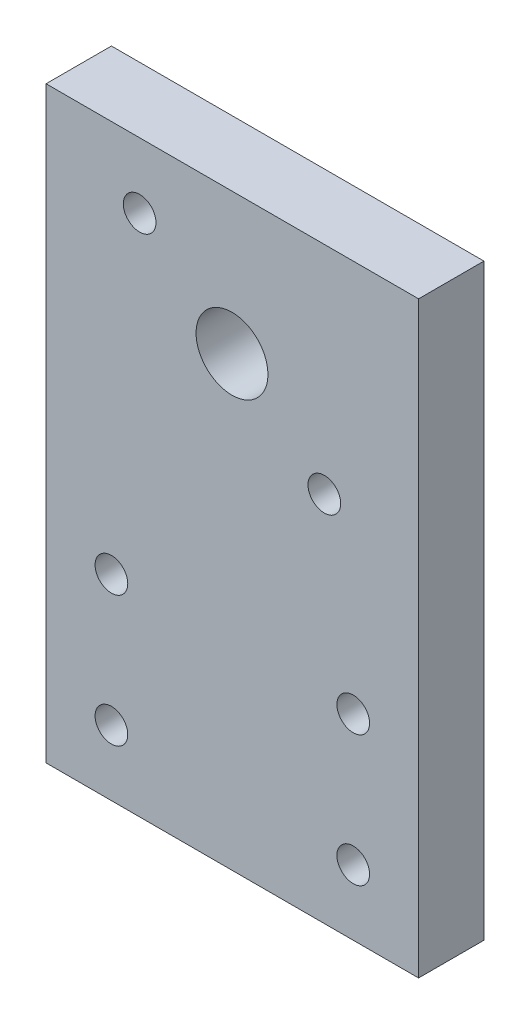
ISO-10303-21;
HEADER;
FILE_DESCRIPTION(('STEP AP214'),'2;1');
FILE_NAME('part.step','',(''),(''),'','','');
FILE_SCHEMA(('AUTOMOTIVE_DESIGN { 1 0 10303 214 1 1 1 1 }'));
ENDSEC;
DATA;
#1=APPLICATION_CONTEXT('core data for automotive mechanical design processes');
#2=APPLICATION_PROTOCOL_DEFINITION('international standard','automotive_design',2000,#1);
#3=PRODUCT_CONTEXT('',#1,'mechanical');
#4=PRODUCT('Part','Part','',(#3));
#5=PRODUCT_RELATED_PRODUCT_CATEGORY('part','',(#4));
#6=PRODUCT_DEFINITION_FORMATION('','',#4);
#7=PRODUCT_DEFINITION_CONTEXT('part definition',#1,'design');
#8=PRODUCT_DEFINITION('design','',#6,#7);
#9=PRODUCT_DEFINITION_SHAPE('','',#8);
#10=(LENGTH_UNIT() NAMED_UNIT(*) SI_UNIT(.MILLI.,.METRE.));
#11=(NAMED_UNIT(*) PLANE_ANGLE_UNIT() SI_UNIT($,.RADIAN.));
#12=(NAMED_UNIT(*) SI_UNIT($,.STERADIAN.) SOLID_ANGLE_UNIT());
#13=UNCERTAINTY_MEASURE_WITH_UNIT(LENGTH_MEASURE(1.E-05),#10,'distance_accuracy_value','');
#14=(GEOMETRIC_REPRESENTATION_CONTEXT(3) GLOBAL_UNCERTAINTY_ASSIGNED_CONTEXT((#13)) GLOBAL_UNIT_ASSIGNED_CONTEXT((#10,
#11,#12)) REPRESENTATION_CONTEXT('',''));
#15=CARTESIAN_POINT('',(0.,0.,0.));
#16=DIRECTION('',(0.,0.,1.));
#17=DIRECTION('',(1.,0.,0.));
#18=AXIS2_PLACEMENT_3D('',#15,#16,#17);
#19=CARTESIAN_POINT('',(0.,90.,10.));
#20=DIRECTION('',(1.,0.,0.));
#21=DIRECTION('',(0.,1.,0.));
#22=AXIS2_PLACEMENT_3D('',#19,#20,#21);
#23=PLANE('',#22);
#24=DIRECTION('',(0.,-1.,0.));
#25=VECTOR('',#24,1.);
#26=CARTESIAN_POINT('',(0.,90.,0.));
#27=LINE('',#26,#25);
#28=CARTESIAN_POINT('',(0.,90.,0.));
#29=VERTEX_POINT('',#28);
#30=CARTESIAN_POINT('',(0.,0.,0.));
#31=VERTEX_POINT('',#30);
#32=EDGE_CURVE('E111',#29,#31,#27,.T.);
#33=ORIENTED_EDGE('',*,*,#32,.T.);
#34=DIRECTION('',(0.,0.,-1.));
#35=VECTOR('',#34,1.);
#36=CARTESIAN_POINT('',(0.,0.,10.));
#37=LINE('',#36,#35);
#38=CARTESIAN_POINT('',(0.,0.,10.));
#39=VERTEX_POINT('',#38);
#40=EDGE_CURVE('E11',#39,#31,#37,.T.);
#41=ORIENTED_EDGE('',*,*,#40,.F.);
#42=DIRECTION('',(0.,-1.,0.));
#43=VECTOR('',#42,1.);
#44=CARTESIAN_POINT('',(0.,90.,10.));
#45=LINE('',#44,#43);
#46=CARTESIAN_POINT('',(0.,90.,10.));
#47=VERTEX_POINT('',#46);
#48=EDGE_CURVE('E95',#47,#39,#45,.T.);
#49=ORIENTED_EDGE('',*,*,#48,.F.);
#50=DIRECTION('',(0.,0.,-1.));
#51=VECTOR('',#50,1.);
#52=CARTESIAN_POINT('',(0.,90.,10.));
#53=LINE('',#52,#51);
#54=EDGE_CURVE('E107',#47,#29,#53,.T.);
#55=ORIENTED_EDGE('',*,*,#54,.T.);
#56=EDGE_LOOP('',(#33,#41,#49,#55));
#57=FACE_BOUND('',#56,.T.);
#58=ADVANCED_FACE('F43',(#57),#23,.F.);
#59=CARTESIAN_POINT('',(0.,0.,10.));
#60=DIRECTION('',(0.,1.,0.));
#61=DIRECTION('',(0.,0.,1.));
#62=AXIS2_PLACEMENT_3D('',#59,#60,#61);
#63=PLANE('',#62);
#64=DIRECTION('',(1.,0.,0.));
#65=VECTOR('',#64,1.);
#66=CARTESIAN_POINT('',(0.,0.,0.));
#67=LINE('',#66,#65);
#68=CARTESIAN_POINT('',(57.,0.,0.));
#69=VERTEX_POINT('',#68);
#70=EDGE_CURVE('E100',#31,#69,#67,.T.);
#71=ORIENTED_EDGE('',*,*,#70,.T.);
#72=DIRECTION('',(0.,0.,-1.));
#73=VECTOR('',#72,1.);
#74=CARTESIAN_POINT('',(57.,0.,10.));
#75=LINE('',#74,#73);
#76=CARTESIAN_POINT('',(57.,0.,10.));
#77=VERTEX_POINT('',#76);
#78=EDGE_CURVE('E52',#77,#69,#75,.T.);
#79=ORIENTED_EDGE('',*,*,#78,.F.);
#80=DIRECTION('',(1.,0.,0.));
#81=VECTOR('',#80,1.);
#82=CARTESIAN_POINT('',(0.,0.,10.));
#83=LINE('',#82,#81);
#84=EDGE_CURVE('E90',#39,#77,#83,.T.);
#85=ORIENTED_EDGE('',*,*,#84,.F.);
#86=ORIENTED_EDGE('',*,*,#40,.T.);
#87=EDGE_LOOP('',(#71,#79,#85,#86));
#88=FACE_BOUND('',#87,.T.);
#89=ADVANCED_FACE('F99',(#88),#63,.F.);
#90=CARTESIAN_POINT('',(57.,0.,10.));
#91=DIRECTION('',(-1.,0.,0.));
#92=DIRECTION('',(0.,0.,1.));
#93=AXIS2_PLACEMENT_3D('',#90,#91,#92);
#94=PLANE('',#93);
#95=DIRECTION('',(0.,1.,0.));
#96=VECTOR('',#95,1.);
#97=CARTESIAN_POINT('',(57.,0.,0.));
#98=LINE('',#97,#96);
#99=CARTESIAN_POINT('',(57.,90.,0.));
#100=VERTEX_POINT('',#99);
#101=EDGE_CURVE('E77',#69,#100,#98,.T.);
#102=ORIENTED_EDGE('',*,*,#101,.T.);
#103=DIRECTION('',(0.,0.,-1.));
#104=VECTOR('',#103,1.);
#105=CARTESIAN_POINT('',(57.,90.,10.));
#106=LINE('',#105,#104);
#107=CARTESIAN_POINT('',(57.,90.,10.));
#108=VERTEX_POINT('',#107);
#109=EDGE_CURVE('E102',#108,#100,#106,.T.);
#110=ORIENTED_EDGE('',*,*,#109,.F.);
#111=DIRECTION('',(0.,1.,0.));
#112=VECTOR('',#111,1.);
#113=CARTESIAN_POINT('',(57.,0.,10.));
#114=LINE('',#113,#112);
#115=EDGE_CURVE('E93',#77,#108,#114,.T.);
#116=ORIENTED_EDGE('',*,*,#115,.F.);
#117=ORIENTED_EDGE('',*,*,#78,.T.);
#118=EDGE_LOOP('',(#102,#110,#116,#117));
#119=FACE_BOUND('',#118,.T.);
#120=ADVANCED_FACE('F103',(#119),#94,.F.);
#121=CARTESIAN_POINT('',(57.,90.,10.));
#122=DIRECTION('',(0.,-1.,0.));
#123=DIRECTION('',(0.,0.,-1.));
#124=AXIS2_PLACEMENT_3D('',#121,#122,#123);
#125=PLANE('',#124);
#126=DIRECTION('',(-1.,0.,0.));
#127=VECTOR('',#126,1.);
#128=CARTESIAN_POINT('',(57.,90.,0.));
#129=LINE('',#128,#127);
#130=EDGE_CURVE('E83',#100,#29,#129,.T.);
#131=ORIENTED_EDGE('',*,*,#130,.T.);
#132=ORIENTED_EDGE('',*,*,#54,.F.);
#133=DIRECTION('',(-1.,0.,0.));
#134=VECTOR('',#133,1.);
#135=CARTESIAN_POINT('',(57.,90.,10.));
#136=LINE('',#135,#134);
#137=EDGE_CURVE('E60',#108,#47,#136,.T.);
#138=ORIENTED_EDGE('',*,*,#137,.F.);
#139=ORIENTED_EDGE('',*,*,#109,.T.);
#140=EDGE_LOOP('',(#131,#132,#138,#139));
#141=FACE_BOUND('',#140,.T.);
#142=ADVANCED_FACE('F125',(#141),#125,.F.);
#143=CARTESIAN_POINT('',(0.,0.,10.));
#144=DIRECTION('',(0.,0.,1.));
#145=DIRECTION('',(1.,0.,0.));
#146=AXIS2_PLACEMENT_3D('',#143,#144,#145);
#147=PLANE('',#146);
#148=CARTESIAN_POINT('',(28.45,68.45,10.));
#149=DIRECTION('',(0.,0.,1.));
#150=DIRECTION('',(1.,0.,0.));
#151=AXIS2_PLACEMENT_3D('',#148,#149,#150);
#152=CIRCLE('',#151,5.5);
#153=CARTESIAN_POINT('',(33.95,68.45,10.));
#154=VERTEX_POINT('',#153);
#155=EDGE_CURVE('E160',#154,#154,#152,.T.);
#156=ORIENTED_EDGE('',*,*,#155,.F.);
#157=EDGE_LOOP('',(#156));
#158=FACE_BOUND('',#157,.T.);
#159=CARTESIAN_POINT('',(10.,10.,10.));
#160=DIRECTION('',(0.,0.,1.));
#161=DIRECTION('',(1.,0.,0.));
#162=AXIS2_PLACEMENT_3D('',#159,#160,#161);
#163=CIRCLE('',#162,2.5);
#164=CARTESIAN_POINT('',(12.5,10.,10.));
#165=VERTEX_POINT('',#164);
#166=EDGE_CURVE('E145',#165,#165,#163,.T.);
#167=ORIENTED_EDGE('',*,*,#166,.F.);
#168=EDGE_LOOP('',(#167));
#169=FACE_BOUND('',#168,.T.);
#170=CARTESIAN_POINT('',(47.,30.,10.));
#171=DIRECTION('',(0.,0.,1.));
#172=DIRECTION('',(1.,0.,0.));
#173=AXIS2_PLACEMENT_3D('',#170,#171,#172);
#174=CIRCLE('',#173,2.5);
#175=CARTESIAN_POINT('',(49.5,30.,10.));
#176=VERTEX_POINT('',#175);
#177=EDGE_CURVE('E144',#176,#176,#174,.T.);
#178=ORIENTED_EDGE('',*,*,#177,.F.);
#179=EDGE_LOOP('',(#178));
#180=FACE_BOUND('',#179,.T.);
#181=CARTESIAN_POINT('',(10.,30.,10.));
#182=DIRECTION('',(0.,0.,1.));
#183=DIRECTION('',(1.,0.,0.));
#184=AXIS2_PLACEMENT_3D('',#181,#182,#183);
#185=CIRCLE('',#184,2.5);
#186=CARTESIAN_POINT('',(12.5,30.,10.));
#187=VERTEX_POINT('',#186);
#188=EDGE_CURVE('E136',#187,#187,#185,.T.);
#189=ORIENTED_EDGE('',*,*,#188,.F.);
#190=EDGE_LOOP('',(#189));
#191=FACE_BOUND('',#190,.T.);
#192=CARTESIAN_POINT('',(42.5801096952572,56.9,10.));
#193=DIRECTION('',(0.,0.,1.));
#194=DIRECTION('',(1.,0.,0.));
#195=AXIS2_PLACEMENT_3D('',#192,#193,#194);
#196=CIRCLE('',#195,2.5);
#197=CARTESIAN_POINT('',(45.0801096952572,56.9,10.));
#198=VERTEX_POINT('',#197);
#199=EDGE_CURVE('E161',#198,#198,#196,.T.);
#200=ORIENTED_EDGE('',*,*,#199,.F.);
#201=EDGE_LOOP('',(#200));
#202=FACE_BOUND('',#201,.T.);
#203=CARTESIAN_POINT('',(14.3198903047429,80.,10.));
#204=DIRECTION('',(0.,0.,1.));
#205=DIRECTION('',(1.,0.,0.));
#206=AXIS2_PLACEMENT_3D('',#203,#204,#205);
#207=CIRCLE('',#206,2.5);
#208=CARTESIAN_POINT('',(16.8198903047429,80.,10.));
#209=VERTEX_POINT('',#208);
#210=EDGE_CURVE('E176',#209,#209,#207,.T.);
#211=ORIENTED_EDGE('',*,*,#210,.F.);
#212=EDGE_LOOP('',(#211));
#213=FACE_BOUND('',#212,.T.);
#214=CARTESIAN_POINT('',(47.,10.,10.));
#215=DIRECTION('',(0.,0.,1.));
#216=DIRECTION('',(1.,0.,0.));
#217=AXIS2_PLACEMENT_3D('',#214,#215,#216);
#218=CIRCLE('',#217,2.5);
#219=CARTESIAN_POINT('',(49.5,10.,10.));
#220=VERTEX_POINT('',#219);
#221=EDGE_CURVE('E132',#220,#220,#218,.T.);
#222=ORIENTED_EDGE('',*,*,#221,.F.);
#223=EDGE_LOOP('',(#222));
#224=FACE_BOUND('',#223,.T.);
#225=ORIENTED_EDGE('',*,*,#48,.T.);
#226=ORIENTED_EDGE('',*,*,#84,.T.);
#227=ORIENTED_EDGE('',*,*,#115,.T.);
#228=ORIENTED_EDGE('',*,*,#137,.T.);
#229=EDGE_LOOP('',(#225,#226,#227,#228));
#230=FACE_BOUND('',#229,.T.);
#231=ADVANCED_FACE('F91',(#158,#169,#180,#191,#202,#213,#224,#230),#147,.T.);
#232=CARTESIAN_POINT('',(0.,0.,0.));
#233=DIRECTION('',(0.,0.,1.));
#234=DIRECTION('',(1.,0.,0.));
#235=AXIS2_PLACEMENT_3D('',#232,#233,#234);
#236=PLANE('',#235);
#237=CARTESIAN_POINT('',(28.45,68.45,0.));
#238=DIRECTION('',(0.,0.,1.));
#239=DIRECTION('',(1.,0.,0.));
#240=AXIS2_PLACEMENT_3D('',#237,#238,#239);
#241=CIRCLE('',#240,5.5);
#242=CARTESIAN_POINT('',(33.95,68.45,0.));
#243=VERTEX_POINT('',#242);
#244=EDGE_CURVE('E156',#243,#243,#241,.T.);
#245=ORIENTED_EDGE('',*,*,#244,.T.);
#246=EDGE_LOOP('',(#245));
#247=FACE_BOUND('',#246,.T.);
#248=CARTESIAN_POINT('',(10.,10.,0.));
#249=DIRECTION('',(0.,0.,1.));
#250=DIRECTION('',(1.,0.,0.));
#251=AXIS2_PLACEMENT_3D('',#248,#249,#250);
#252=CIRCLE('',#251,2.5);
#253=CARTESIAN_POINT('',(12.5,10.,0.));
#254=VERTEX_POINT('',#253);
#255=EDGE_CURVE('E165',#254,#254,#252,.T.);
#256=ORIENTED_EDGE('',*,*,#255,.T.);
#257=EDGE_LOOP('',(#256));
#258=FACE_BOUND('',#257,.T.);
#259=CARTESIAN_POINT('',(47.,30.,0.));
#260=DIRECTION('',(0.,0.,1.));
#261=DIRECTION('',(1.,0.,0.));
#262=AXIS2_PLACEMENT_3D('',#259,#260,#261);
#263=CIRCLE('',#262,2.5);
#264=CARTESIAN_POINT('',(49.5,30.,0.));
#265=VERTEX_POINT('',#264);
#266=EDGE_CURVE('E140',#265,#265,#263,.T.);
#267=ORIENTED_EDGE('',*,*,#266,.T.);
#268=EDGE_LOOP('',(#267));
#269=FACE_BOUND('',#268,.T.);
#270=CARTESIAN_POINT('',(10.,30.,0.));
#271=DIRECTION('',(0.,0.,1.));
#272=DIRECTION('',(1.,0.,0.));
#273=AXIS2_PLACEMENT_3D('',#270,#271,#272);
#274=CIRCLE('',#273,2.5);
#275=CARTESIAN_POINT('',(12.5,30.,0.));
#276=VERTEX_POINT('',#275);
#277=EDGE_CURVE('E149',#276,#276,#274,.T.);
#278=ORIENTED_EDGE('',*,*,#277,.T.);
#279=EDGE_LOOP('',(#278));
#280=FACE_BOUND('',#279,.T.);
#281=CARTESIAN_POINT('',(42.5801096952572,56.9,0.));
#282=DIRECTION('',(0.,0.,1.));
#283=DIRECTION('',(1.,0.,0.));
#284=AXIS2_PLACEMENT_3D('',#281,#282,#283);
#285=CIRCLE('',#284,2.5);
#286=CARTESIAN_POINT('',(45.0801096952572,56.9,0.));
#287=VERTEX_POINT('',#286);
#288=EDGE_CURVE('E180',#287,#287,#285,.T.);
#289=ORIENTED_EDGE('',*,*,#288,.T.);
#290=EDGE_LOOP('',(#289));
#291=FACE_BOUND('',#290,.T.);
#292=CARTESIAN_POINT('',(14.3198903047429,80.,0.));
#293=DIRECTION('',(0.,0.,1.));
#294=DIRECTION('',(1.,0.,0.));
#295=AXIS2_PLACEMENT_3D('',#292,#293,#294);
#296=CIRCLE('',#295,2.5);
#297=CARTESIAN_POINT('',(16.8198903047429,80.,0.));
#298=VERTEX_POINT('',#297);
#299=EDGE_CURVE('E172',#298,#298,#296,.T.);
#300=ORIENTED_EDGE('',*,*,#299,.T.);
#301=EDGE_LOOP('',(#300));
#302=FACE_BOUND('',#301,.T.);
#303=CARTESIAN_POINT('',(47.,10.,0.));
#304=DIRECTION('',(0.,0.,1.));
#305=DIRECTION('',(1.,0.,0.));
#306=AXIS2_PLACEMENT_3D('',#303,#304,#305);
#307=CIRCLE('',#306,2.5);
#308=CARTESIAN_POINT('',(49.5,10.,0.));
#309=VERTEX_POINT('',#308);
#310=EDGE_CURVE('E115',#309,#309,#307,.T.);
#311=ORIENTED_EDGE('',*,*,#310,.T.);
#312=EDGE_LOOP('',(#311));
#313=FACE_BOUND('',#312,.T.);
#314=ORIENTED_EDGE('',*,*,#32,.F.);
#315=ORIENTED_EDGE('',*,*,#130,.F.);
#316=ORIENTED_EDGE('',*,*,#101,.F.);
#317=ORIENTED_EDGE('',*,*,#70,.F.);
#318=EDGE_LOOP('',(#314,#315,#316,#317));
#319=FACE_BOUND('',#318,.T.);
#320=ADVANCED_FACE('F128',(#247,#258,#269,#280,#291,#302,#313,#319),#236,.F.);
#321=CARTESIAN_POINT('',(47.,10.,0.));
#322=DIRECTION('',(0.,0.,1.));
#323=DIRECTION('',(1.,0.,0.));
#324=AXIS2_PLACEMENT_3D('',#321,#322,#323);
#325=CYLINDRICAL_SURFACE('',#324,2.5);
#326=ORIENTED_EDGE('',*,*,#310,.F.);
#327=EDGE_LOOP('',(#326));
#328=FACE_BOUND('',#327,.T.);
#329=ORIENTED_EDGE('',*,*,#221,.T.);
#330=EDGE_LOOP('',(#329));
#331=FACE_BOUND('',#330,.T.);
#332=ADVANCED_FACE('F198',(#328,#331),#325,.F.);
#333=CARTESIAN_POINT('',(14.3198903047429,80.,0.));
#334=DIRECTION('',(0.,0.,1.));
#335=DIRECTION('',(1.,0.,0.));
#336=AXIS2_PLACEMENT_3D('',#333,#334,#335);
#337=CYLINDRICAL_SURFACE('',#336,2.5);
#338=ORIENTED_EDGE('',*,*,#299,.F.);
#339=EDGE_LOOP('',(#338));
#340=FACE_BOUND('',#339,.T.);
#341=ORIENTED_EDGE('',*,*,#210,.T.);
#342=EDGE_LOOP('',(#341));
#343=FACE_BOUND('',#342,.T.);
#344=ADVANCED_FACE('F200',(#340,#343),#337,.F.);
#345=CARTESIAN_POINT('',(42.5801096952572,56.9,0.));
#346=DIRECTION('',(0.,0.,1.));
#347=DIRECTION('',(1.,0.,0.));
#348=AXIS2_PLACEMENT_3D('',#345,#346,#347);
#349=CYLINDRICAL_SURFACE('',#348,2.5);
#350=ORIENTED_EDGE('',*,*,#288,.F.);
#351=EDGE_LOOP('',(#350));
#352=FACE_BOUND('',#351,.T.);
#353=ORIENTED_EDGE('',*,*,#199,.T.);
#354=EDGE_LOOP('',(#353));
#355=FACE_BOUND('',#354,.T.);
#356=ADVANCED_FACE('F188',(#352,#355),#349,.F.);
#357=CARTESIAN_POINT('',(10.,30.,0.));
#358=DIRECTION('',(0.,0.,1.));
#359=DIRECTION('',(1.,0.,0.));
#360=AXIS2_PLACEMENT_3D('',#357,#358,#359);
#361=CYLINDRICAL_SURFACE('',#360,2.5);
#362=ORIENTED_EDGE('',*,*,#277,.F.);
#363=EDGE_LOOP('',(#362));
#364=FACE_BOUND('',#363,.T.);
#365=ORIENTED_EDGE('',*,*,#188,.T.);
#366=EDGE_LOOP('',(#365));
#367=FACE_BOUND('',#366,.T.);
#368=ADVANCED_FACE('F257',(#364,#367),#361,.F.);
#369=CARTESIAN_POINT('',(47.,30.,0.));
#370=DIRECTION('',(0.,0.,1.));
#371=DIRECTION('',(1.,0.,0.));
#372=AXIS2_PLACEMENT_3D('',#369,#370,#371);
#373=CYLINDRICAL_SURFACE('',#372,2.5);
#374=ORIENTED_EDGE('',*,*,#266,.F.);
#375=EDGE_LOOP('',(#374));
#376=FACE_BOUND('',#375,.T.);
#377=ORIENTED_EDGE('',*,*,#177,.T.);
#378=EDGE_LOOP('',(#377));
#379=FACE_BOUND('',#378,.T.);
#380=ADVANCED_FACE('F268',(#376,#379),#373,.F.);
#381=CARTESIAN_POINT('',(10.,10.,0.));
#382=DIRECTION('',(0.,0.,1.));
#383=DIRECTION('',(1.,0.,0.));
#384=AXIS2_PLACEMENT_3D('',#381,#382,#383);
#385=CYLINDRICAL_SURFACE('',#384,2.5);
#386=ORIENTED_EDGE('',*,*,#255,.F.);
#387=EDGE_LOOP('',(#386));
#388=FACE_BOUND('',#387,.T.);
#389=ORIENTED_EDGE('',*,*,#166,.T.);
#390=EDGE_LOOP('',(#389));
#391=FACE_BOUND('',#390,.T.);
#392=ADVANCED_FACE('F279',(#388,#391),#385,.F.);
#393=CARTESIAN_POINT('',(28.45,68.45,0.));
#394=DIRECTION('',(0.,0.,1.));
#395=DIRECTION('',(1.,0.,0.));
#396=AXIS2_PLACEMENT_3D('',#393,#394,#395);
#397=CYLINDRICAL_SURFACE('',#396,5.5);
#398=ORIENTED_EDGE('',*,*,#244,.F.);
#399=EDGE_LOOP('',(#398));
#400=FACE_BOUND('',#399,.T.);
#401=ORIENTED_EDGE('',*,*,#155,.T.);
#402=EDGE_LOOP('',(#401));
#403=FACE_BOUND('',#402,.T.);
#404=ADVANCED_FACE('F289',(#400,#403),#397,.F.);
#405=CLOSED_SHELL('',(#58,#89,#120,#142,#231,#320,#332,#344,#356,#368,#380,#392,#404));
#406=MANIFOLD_SOLID_BREP('B2',#405);
#407=ADVANCED_BREP_SHAPE_REPRESENTATION('',(#18,#406),#14);
#408=SHAPE_DEFINITION_REPRESENTATION(#9,#407);
ENDSEC;
END-ISO-10303-21;
